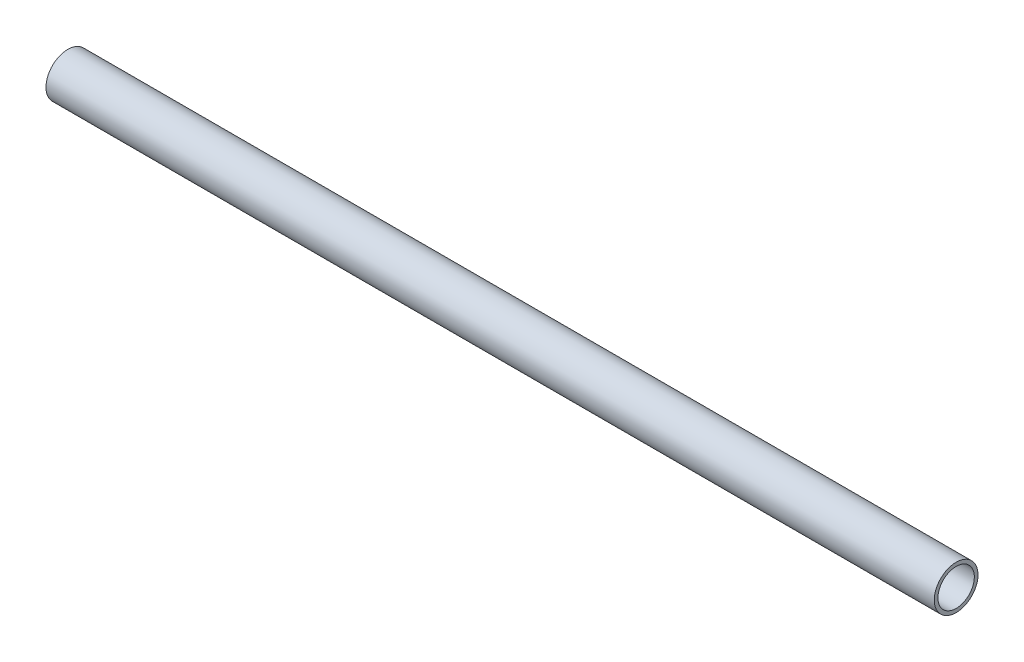
ISO-10303-21;
HEADER;
FILE_DESCRIPTION(('STEP AP214'),'2;1');
FILE_NAME('part.step','',(''),(''),'','','');
FILE_SCHEMA(('AUTOMOTIVE_DESIGN { 1 0 10303 214 1 1 1 1 }'));
ENDSEC;
DATA;
#1=APPLICATION_CONTEXT('core data for automotive mechanical design processes');
#2=APPLICATION_PROTOCOL_DEFINITION('international standard','automotive_design',2000,#1);
#3=PRODUCT_CONTEXT('',#1,'mechanical');
#4=PRODUCT('Part','Part','',(#3));
#5=PRODUCT_RELATED_PRODUCT_CATEGORY('part','',(#4));
#6=PRODUCT_DEFINITION_FORMATION('','',#4);
#7=PRODUCT_DEFINITION_CONTEXT('part definition',#1,'design');
#8=PRODUCT_DEFINITION('design','',#6,#7);
#9=PRODUCT_DEFINITION_SHAPE('','',#8);
#10=(LENGTH_UNIT() NAMED_UNIT(*) SI_UNIT(.MILLI.,.METRE.));
#11=(NAMED_UNIT(*) PLANE_ANGLE_UNIT() SI_UNIT($,.RADIAN.));
#12=(NAMED_UNIT(*) SI_UNIT($,.STERADIAN.) SOLID_ANGLE_UNIT());
#13=UNCERTAINTY_MEASURE_WITH_UNIT(LENGTH_MEASURE(1.E-05),#10,'distance_accuracy_value','');
#14=(GEOMETRIC_REPRESENTATION_CONTEXT(3) GLOBAL_UNCERTAINTY_ASSIGNED_CONTEXT((#13)) GLOBAL_UNIT_ASSIGNED_CONTEXT((#10,
#11,#12)) REPRESENTATION_CONTEXT('',''));
#15=CARTESIAN_POINT('',(0.,0.,0.));
#16=DIRECTION('',(0.,0.,1.));
#17=DIRECTION('',(1.,0.,0.));
#18=AXIS2_PLACEMENT_3D('',#15,#16,#17);
#19=CARTESIAN_POINT('',(275.553691361753,1527.51279613655,0.));
#20=DIRECTION('',(-1.,0.,0.));
#21=DIRECTION('',(0.,-1.,0.));
#22=AXIS2_PLACEMENT_3D('',#19,#20,#21);
#23=CYLINDRICAL_SURFACE('',#22,5.28319999999993);
#24=CARTESIAN_POINT('',(275.553691361753,1527.51279613655,0.));
#25=DIRECTION('',(1.,0.,0.));
#26=DIRECTION('',(0.,1.,0.));
#27=AXIS2_PLACEMENT_3D('',#24,#25,#26);
#28=CIRCLE('',#27,5.28319999999993);
#29=CARTESIAN_POINT('',(275.553691361753,1532.79599613656,0.));
#30=VERTEX_POINT('',#29);
#31=EDGE_CURVE('E45',#30,#30,#28,.T.);
#32=ORIENTED_EDGE('',*,*,#31,.T.);
#33=EDGE_LOOP('',(#32));
#34=FACE_BOUND('',#33,.T.);
#35=CARTESIAN_POINT('',(17.622221572135,1527.51279613653,0.));
#36=DIRECTION('',(1.,0.,0.));
#37=DIRECTION('',(0.,1.,0.));
#38=AXIS2_PLACEMENT_3D('',#35,#36,#37);
#39=CIRCLE('',#38,5.28319999999993);
#40=CARTESIAN_POINT('',(17.6222215721345,1532.79599613653,0.));
#41=VERTEX_POINT('',#40);
#42=EDGE_CURVE('E51',#41,#41,#39,.T.);
#43=ORIENTED_EDGE('',*,*,#42,.F.);
#44=EDGE_LOOP('',(#43));
#45=FACE_BOUND('',#44,.T.);
#46=ADVANCED_FACE('F38',(#34,#45),#23,.F.);
#47=CARTESIAN_POINT('',(275.553691361753,1527.51279613655,0.));
#48=DIRECTION('',(-1.,0.,0.));
#49=DIRECTION('',(0.,-1.,0.));
#50=AXIS2_PLACEMENT_3D('',#47,#48,#49);
#51=CYLINDRICAL_SURFACE('',#50,6.34999999999994);
#52=CARTESIAN_POINT('',(275.553691361753,1527.51279613655,0.));
#53=DIRECTION('',(1.,0.,0.));
#54=DIRECTION('',(0.,1.,0.));
#55=AXIS2_PLACEMENT_3D('',#52,#53,#54);
#56=CIRCLE('',#55,6.34999999999994);
#57=CARTESIAN_POINT('',(275.553691361753,1533.86279613655,0.));
#58=VERTEX_POINT('',#57);
#59=EDGE_CURVE('E11',#58,#58,#56,.T.);
#60=ORIENTED_EDGE('',*,*,#59,.F.);
#61=EDGE_LOOP('',(#60));
#62=FACE_BOUND('',#61,.T.);
#63=CARTESIAN_POINT('',(17.622221572135,1527.51279613653,0.));
#64=DIRECTION('',(1.,0.,0.));
#65=DIRECTION('',(0.,1.,0.));
#66=AXIS2_PLACEMENT_3D('',#63,#64,#65);
#67=CIRCLE('',#66,6.34999999999994);
#68=CARTESIAN_POINT('',(17.6222215721344,1533.86279613653,0.));
#69=VERTEX_POINT('',#68);
#70=EDGE_CURVE('E41',#69,#69,#67,.T.);
#71=ORIENTED_EDGE('',*,*,#70,.T.);
#72=EDGE_LOOP('',(#71));
#73=FACE_BOUND('',#72,.T.);
#74=ADVANCED_FACE('F58',(#62,#73),#51,.T.);
#75=CARTESIAN_POINT('',(275.553691361753,1527.51279613655,0.));
#76=DIRECTION('',(1.,0.,0.));
#77=DIRECTION('',(0.,1.,0.));
#78=AXIS2_PLACEMENT_3D('',#75,#76,#77);
#79=PLANE('',#78);
#80=ORIENTED_EDGE('',*,*,#31,.F.);
#81=EDGE_LOOP('',(#80));
#82=FACE_BOUND('',#81,.T.);
#83=ORIENTED_EDGE('',*,*,#59,.T.);
#84=EDGE_LOOP('',(#83));
#85=FACE_BOUND('',#84,.T.);
#86=ADVANCED_FACE('F62',(#82,#85),#79,.T.);
#87=CARTESIAN_POINT('',(17.622221572135,1527.51279613653,0.));
#88=DIRECTION('',(1.,0.,0.));
#89=DIRECTION('',(0.,1.,0.));
#90=AXIS2_PLACEMENT_3D('',#87,#88,#89);
#91=PLANE('',#90);
#92=ORIENTED_EDGE('',*,*,#42,.T.);
#93=EDGE_LOOP('',(#92));
#94=FACE_BOUND('',#93,.T.);
#95=ORIENTED_EDGE('',*,*,#70,.F.);
#96=EDGE_LOOP('',(#95));
#97=FACE_BOUND('',#96,.T.);
#98=ADVANCED_FACE('F60',(#94,#97),#91,.F.);
#99=CLOSED_SHELL('',(#46,#74,#86,#98));
#100=MANIFOLD_SOLID_BREP('B2',#99);
#101=ADVANCED_BREP_SHAPE_REPRESENTATION('',(#18,#100),#14);
#102=SHAPE_DEFINITION_REPRESENTATION(#9,#101);
ENDSEC;
END-ISO-10303-21;
